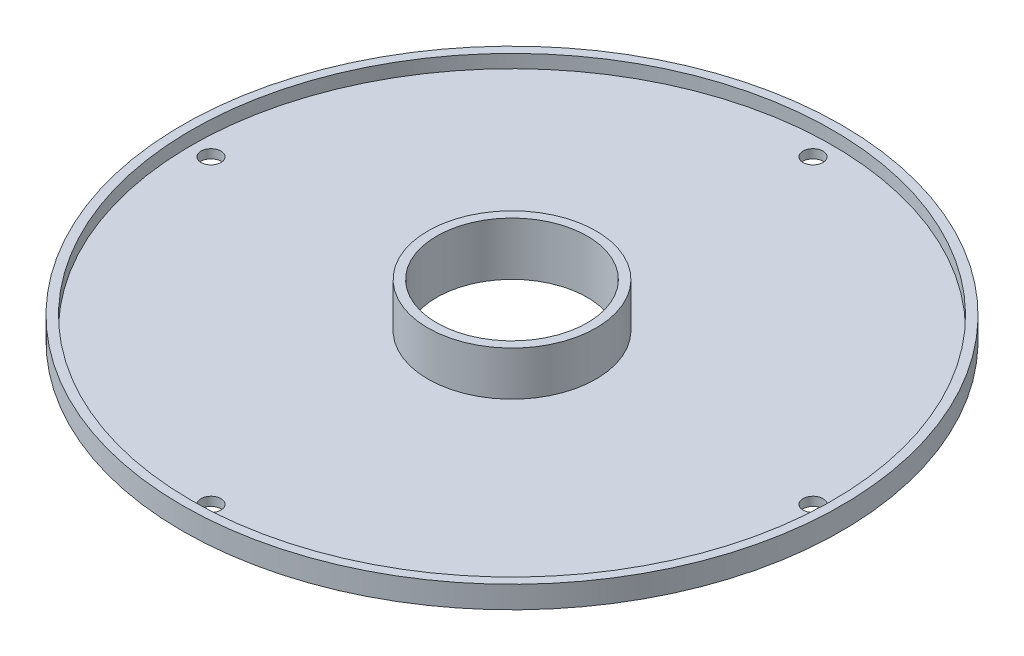
ISO-10303-21;
HEADER;
FILE_DESCRIPTION(('STEP AP214'),'2;1');
FILE_NAME('part.step','',(''),(''),'','','');
FILE_SCHEMA(('AUTOMOTIVE_DESIGN { 1 0 10303 214 1 1 1 1 }'));
ENDSEC;
DATA;
#1=APPLICATION_CONTEXT('core data for automotive mechanical design processes');
#2=APPLICATION_PROTOCOL_DEFINITION('international standard','automotive_design',2000,#1);
#3=PRODUCT_CONTEXT('',#1,'mechanical');
#4=PRODUCT('Part','Part','',(#3));
#5=PRODUCT_RELATED_PRODUCT_CATEGORY('part','',(#4));
#6=PRODUCT_DEFINITION_FORMATION('','',#4);
#7=PRODUCT_DEFINITION_CONTEXT('part definition',#1,'design');
#8=PRODUCT_DEFINITION('design','',#6,#7);
#9=PRODUCT_DEFINITION_SHAPE('','',#8);
#10=(LENGTH_UNIT() NAMED_UNIT(*) SI_UNIT(.MILLI.,.METRE.));
#11=(NAMED_UNIT(*) PLANE_ANGLE_UNIT() SI_UNIT($,.RADIAN.));
#12=(NAMED_UNIT(*) SI_UNIT($,.STERADIAN.) SOLID_ANGLE_UNIT());
#13=UNCERTAINTY_MEASURE_WITH_UNIT(LENGTH_MEASURE(1.E-05),#10,'distance_accuracy_value','');
#14=(GEOMETRIC_REPRESENTATION_CONTEXT(3) GLOBAL_UNCERTAINTY_ASSIGNED_CONTEXT((#13)) GLOBAL_UNIT_ASSIGNED_CONTEXT((#10,
#11,#12)) REPRESENTATION_CONTEXT('',''));
#15=CARTESIAN_POINT('',(0.,0.,0.));
#16=DIRECTION('',(0.,0.,1.));
#17=DIRECTION('',(1.,0.,0.));
#18=AXIS2_PLACEMENT_3D('',#15,#16,#17);
#19=CARTESIAN_POINT('',(0.,2.,0.));
#20=DIRECTION('',(0.,1.,0.));
#21=DIRECTION('',(0.,0.,1.));
#22=AXIS2_PLACEMENT_3D('',#19,#20,#21);
#23=PLANE('',#22);
#24=CARTESIAN_POINT('',(0.,2.,0.));
#25=DIRECTION('',(0.,1.,0.));
#26=DIRECTION('',(0.,0.,1.));
#27=AXIS2_PLACEMENT_3D('',#24,#25,#26);
#28=CIRCLE('',#27,19.);
#29=CARTESIAN_POINT('',(0.,2.,19.));
#30=VERTEX_POINT('',#29);
#31=EDGE_CURVE('E75',#30,#30,#28,.T.);
#32=ORIENTED_EDGE('',*,*,#31,.F.);
#33=EDGE_LOOP('',(#32));
#34=FACE_BOUND('',#33,.T.);
#35=CARTESIAN_POINT('',(-68.,2.,-4.74841462082666E-13));
#36=DIRECTION('',(0.,1.,0.));
#37=DIRECTION('',(0.,0.,1.));
#38=AXIS2_PLACEMENT_3D('',#35,#36,#37);
#39=CIRCLE('',#38,2.24999999999999);
#40=CARTESIAN_POINT('',(-68.,2.,2.24999999999952));
#41=VERTEX_POINT('',#40);
#42=EDGE_CURVE('E60',#41,#41,#39,.T.);
#43=ORIENTED_EDGE('',*,*,#42,.F.);
#44=EDGE_LOOP('',(#43));
#45=FACE_BOUND('',#44,.T.);
#46=CARTESIAN_POINT('',(68.,2.,0.));
#47=DIRECTION('',(0.,1.,0.));
#48=DIRECTION('',(0.,0.,1.));
#49=AXIS2_PLACEMENT_3D('',#46,#47,#48);
#50=CIRCLE('',#49,2.25);
#51=CARTESIAN_POINT('',(68.,2.,2.25));
#52=VERTEX_POINT('',#51);
#53=EDGE_CURVE('E44',#52,#52,#50,.T.);
#54=ORIENTED_EDGE('',*,*,#53,.F.);
#55=EDGE_LOOP('',(#54));
#56=FACE_BOUND('',#55,.T.);
#57=CARTESIAN_POINT('',(-2.37420731041333E-13,2.,68.));
#58=DIRECTION('',(0.,1.,0.));
#59=DIRECTION('',(0.,0.,1.));
#60=AXIS2_PLACEMENT_3D('',#57,#58,#59);
#61=CIRCLE('',#60,2.24999999999999);
#62=CARTESIAN_POINT('',(-2.37420731041333E-13,2.,70.25));
#63=VERTEX_POINT('',#62);
#64=EDGE_CURVE('E56',#63,#63,#61,.T.);
#65=ORIENTED_EDGE('',*,*,#64,.F.);
#66=EDGE_LOOP('',(#65));
#67=FACE_BOUND('',#66,.T.);
#68=CARTESIAN_POINT('',(7.12262193123999E-13,2.,-68.));
#69=DIRECTION('',(0.,1.,0.));
#70=DIRECTION('',(0.,0.,1.));
#71=AXIS2_PLACEMENT_3D('',#68,#69,#70);
#72=CIRCLE('',#71,2.24999999999999);
#73=CARTESIAN_POINT('',(7.12262193123999E-13,2.,-65.75));
#74=VERTEX_POINT('',#73);
#75=EDGE_CURVE('E66',#74,#74,#72,.T.);
#76=ORIENTED_EDGE('',*,*,#75,.F.);
#77=EDGE_LOOP('',(#76));
#78=FACE_BOUND('',#77,.T.);
#79=CARTESIAN_POINT('',(0.,2.,0.));
#80=DIRECTION('',(0.,1.,0.));
#81=DIRECTION('',(0.,0.,1.));
#82=AXIS2_PLACEMENT_3D('',#79,#80,#81);
#83=CIRCLE('',#82,72.45);
#84=CARTESIAN_POINT('',(0.,2.,72.45));
#85=VERTEX_POINT('',#84);
#86=EDGE_CURVE('E10',#85,#85,#83,.F.);
#87=ORIENTED_EDGE('',*,*,#86,.F.);
#88=EDGE_LOOP('',(#87));
#89=FACE_BOUND('',#88,.T.);
#90=ADVANCED_FACE('F33',(#34,#45,#56,#67,#78,#89),#23,.T.);
#91=CARTESIAN_POINT('',(0.,0.,0.));
#92=DIRECTION('',(0.,1.,0.));
#93=DIRECTION('',(0.,0.,1.));
#94=AXIS2_PLACEMENT_3D('',#91,#92,#93);
#95=PLANE('',#94);
#96=CARTESIAN_POINT('',(0.,0.,0.));
#97=DIRECTION('',(0.,1.,0.));
#98=DIRECTION('',(0.,0.,1.));
#99=AXIS2_PLACEMENT_3D('',#96,#97,#98);
#100=CIRCLE('',#99,74.45);
#101=CARTESIAN_POINT('',(0.,0.,74.45));
#102=VERTEX_POINT('',#101);
#103=EDGE_CURVE('E40',#102,#102,#100,.T.);
#104=ORIENTED_EDGE('',*,*,#103,.F.);
#105=EDGE_LOOP('',(#104));
#106=FACE_BOUND('',#105,.T.);
#107=CARTESIAN_POINT('',(68.,0.,0.));
#108=DIRECTION('',(0.,1.,0.));
#109=DIRECTION('',(0.,0.,1.));
#110=AXIS2_PLACEMENT_3D('',#107,#108,#109);
#111=CIRCLE('',#110,2.25);
#112=CARTESIAN_POINT('',(68.,0.,2.25));
#113=VERTEX_POINT('',#112);
#114=EDGE_CURVE('E48',#113,#113,#111,.T.);
#115=ORIENTED_EDGE('',*,*,#114,.T.);
#116=EDGE_LOOP('',(#115));
#117=FACE_BOUND('',#116,.T.);
#118=CARTESIAN_POINT('',(0.,0.,0.));
#119=DIRECTION('',(0.,1.,0.));
#120=DIRECTION('',(0.,0.,1.));
#121=AXIS2_PLACEMENT_3D('',#118,#119,#120);
#122=CIRCLE('',#121,17.);
#123=CARTESIAN_POINT('',(0.,0.,17.));
#124=VERTEX_POINT('',#123);
#125=EDGE_CURVE('E52',#124,#124,#122,.T.);
#126=ORIENTED_EDGE('',*,*,#125,.T.);
#127=EDGE_LOOP('',(#126));
#128=FACE_BOUND('',#127,.T.);
#129=CARTESIAN_POINT('',(-2.37420731041333E-13,0.,68.));
#130=DIRECTION('',(0.,1.,0.));
#131=DIRECTION('',(0.,0.,1.));
#132=AXIS2_PLACEMENT_3D('',#129,#130,#131);
#133=CIRCLE('',#132,2.24999999999999);
#134=CARTESIAN_POINT('',(-2.37420731041333E-13,0.,70.25));
#135=VERTEX_POINT('',#134);
#136=EDGE_CURVE('E57',#135,#135,#133,.T.);
#137=ORIENTED_EDGE('',*,*,#136,.T.);
#138=EDGE_LOOP('',(#137));
#139=FACE_BOUND('',#138,.T.);
#140=CARTESIAN_POINT('',(-68.,0.,-4.74841462082666E-13));
#141=DIRECTION('',(0.,1.,0.));
#142=DIRECTION('',(0.,0.,1.));
#143=AXIS2_PLACEMENT_3D('',#140,#141,#142);
#144=CIRCLE('',#143,2.24999999999999);
#145=CARTESIAN_POINT('',(-68.,0.,2.24999999999952));
#146=VERTEX_POINT('',#145);
#147=EDGE_CURVE('E63',#146,#146,#144,.T.);
#148=ORIENTED_EDGE('',*,*,#147,.T.);
#149=EDGE_LOOP('',(#148));
#150=FACE_BOUND('',#149,.T.);
#151=CARTESIAN_POINT('',(7.12262193123999E-13,0.,-68.));
#152=DIRECTION('',(0.,1.,0.));
#153=DIRECTION('',(0.,0.,1.));
#154=AXIS2_PLACEMENT_3D('',#151,#152,#153);
#155=CIRCLE('',#154,2.24999999999999);
#156=CARTESIAN_POINT('',(7.12262193123999E-13,0.,-65.75));
#157=VERTEX_POINT('',#156);
#158=EDGE_CURVE('E69',#157,#157,#155,.T.);
#159=ORIENTED_EDGE('',*,*,#158,.T.);
#160=EDGE_LOOP('',(#159));
#161=FACE_BOUND('',#160,.T.);
#162=ADVANCED_FACE('F107',(#106,#117,#128,#139,#150,#161),#95,.F.);
#163=CARTESIAN_POINT('',(0.,2.,0.));
#164=DIRECTION('',(0.,-1.,0.));
#165=DIRECTION('',(0.,0.,-1.));
#166=AXIS2_PLACEMENT_3D('',#163,#164,#165);
#167=CYLINDRICAL_SURFACE('',#166,74.45);
#168=ORIENTED_EDGE('',*,*,#103,.T.);
#169=EDGE_LOOP('',(#168));
#170=FACE_BOUND('',#169,.T.);
#171=CARTESIAN_POINT('',(0.,5.,0.));
#172=DIRECTION('',(0.,1.,0.));
#173=DIRECTION('',(0.,0.,1.));
#174=AXIS2_PLACEMENT_3D('',#171,#172,#173);
#175=CIRCLE('',#174,74.45);
#176=CARTESIAN_POINT('',(0.,5.,74.45));
#177=VERTEX_POINT('',#176);
#178=EDGE_CURVE('E83',#177,#177,#175,.T.);
#179=ORIENTED_EDGE('',*,*,#178,.F.);
#180=EDGE_LOOP('',(#179));
#181=FACE_BOUND('',#180,.T.);
#182=ADVANCED_FACE('F35',(#170,#181),#167,.T.);
#183=CARTESIAN_POINT('',(68.,2.,0.));
#184=DIRECTION('',(0.,-1.,0.));
#185=DIRECTION('',(0.,0.,-1.));
#186=AXIS2_PLACEMENT_3D('',#183,#184,#185);
#187=CYLINDRICAL_SURFACE('',#186,2.25);
#188=ORIENTED_EDGE('',*,*,#53,.T.);
#189=EDGE_LOOP('',(#188));
#190=FACE_BOUND('',#189,.T.);
#191=ORIENTED_EDGE('',*,*,#114,.F.);
#192=EDGE_LOOP('',(#191));
#193=FACE_BOUND('',#192,.T.);
#194=ADVANCED_FACE('F117',(#190,#193),#187,.F.);
#195=CARTESIAN_POINT('',(0.,2.,0.));
#196=DIRECTION('',(0.,-1.,0.));
#197=DIRECTION('',(0.,0.,-1.));
#198=AXIS2_PLACEMENT_3D('',#195,#196,#197);
#199=CYLINDRICAL_SURFACE('',#198,17.);
#200=ORIENTED_EDGE('',*,*,#125,.F.);
#201=EDGE_LOOP('',(#200));
#202=FACE_BOUND('',#201,.T.);
#203=CARTESIAN_POINT('',(0.,12.,0.));
#204=DIRECTION('',(0.,1.,0.));
#205=DIRECTION('',(0.,0.,1.));
#206=AXIS2_PLACEMENT_3D('',#203,#204,#205);
#207=CIRCLE('',#206,17.);
#208=CARTESIAN_POINT('',(0.,12.,17.));
#209=VERTEX_POINT('',#208);
#210=EDGE_CURVE('E78',#209,#209,#207,.T.);
#211=ORIENTED_EDGE('',*,*,#210,.T.);
#212=EDGE_LOOP('',(#211));
#213=FACE_BOUND('',#212,.T.);
#214=ADVANCED_FACE('F120',(#202,#213),#199,.F.);
#215=CARTESIAN_POINT('',(-2.37420731041333E-13,2.,68.));
#216=DIRECTION('',(0.,-1.,0.));
#217=DIRECTION('',(0.,0.,-1.));
#218=AXIS2_PLACEMENT_3D('',#215,#216,#217);
#219=CYLINDRICAL_SURFACE('',#218,2.24999999999999);
#220=ORIENTED_EDGE('',*,*,#64,.T.);
#221=EDGE_LOOP('',(#220));
#222=FACE_BOUND('',#221,.T.);
#223=ORIENTED_EDGE('',*,*,#136,.F.);
#224=EDGE_LOOP('',(#223));
#225=FACE_BOUND('',#224,.T.);
#226=ADVANCED_FACE('F124',(#222,#225),#219,.F.);
#227=CARTESIAN_POINT('',(-68.,2.,-4.74841462082666E-13));
#228=DIRECTION('',(0.,-1.,0.));
#229=DIRECTION('',(0.,0.,-1.));
#230=AXIS2_PLACEMENT_3D('',#227,#228,#229);
#231=CYLINDRICAL_SURFACE('',#230,2.24999999999999);
#232=ORIENTED_EDGE('',*,*,#42,.T.);
#233=EDGE_LOOP('',(#232));
#234=FACE_BOUND('',#233,.T.);
#235=ORIENTED_EDGE('',*,*,#147,.F.);
#236=EDGE_LOOP('',(#235));
#237=FACE_BOUND('',#236,.T.);
#238=ADVANCED_FACE('F128',(#234,#237),#231,.F.);
#239=CARTESIAN_POINT('',(7.12262193123999E-13,2.,-68.));
#240=DIRECTION('',(0.,-1.,0.));
#241=DIRECTION('',(0.,0.,-1.));
#242=AXIS2_PLACEMENT_3D('',#239,#240,#241);
#243=CYLINDRICAL_SURFACE('',#242,2.24999999999999);
#244=ORIENTED_EDGE('',*,*,#75,.T.);
#245=EDGE_LOOP('',(#244));
#246=FACE_BOUND('',#245,.T.);
#247=ORIENTED_EDGE('',*,*,#158,.F.);
#248=EDGE_LOOP('',(#247));
#249=FACE_BOUND('',#248,.T.);
#250=ADVANCED_FACE('F132',(#246,#249),#243,.F.);
#251=CARTESIAN_POINT('',(0.,12.,0.));
#252=DIRECTION('',(0.,1.,0.));
#253=DIRECTION('',(0.,0.,1.));
#254=AXIS2_PLACEMENT_3D('',#251,#252,#253);
#255=PLANE('',#254);
#256=CARTESIAN_POINT('',(0.,12.,0.));
#257=DIRECTION('',(0.,1.,0.));
#258=DIRECTION('',(0.,0.,1.));
#259=AXIS2_PLACEMENT_3D('',#256,#257,#258);
#260=CIRCLE('',#259,19.);
#261=CARTESIAN_POINT('',(0.,12.,19.));
#262=VERTEX_POINT('',#261);
#263=EDGE_CURVE('E72',#262,#262,#260,.T.);
#264=ORIENTED_EDGE('',*,*,#263,.T.);
#265=EDGE_LOOP('',(#264));
#266=FACE_BOUND('',#265,.T.);
#267=ORIENTED_EDGE('',*,*,#210,.F.);
#268=EDGE_LOOP('',(#267));
#269=FACE_BOUND('',#268,.T.);
#270=ADVANCED_FACE('F102',(#266,#269),#255,.T.);
#271=CARTESIAN_POINT('',(0.,12.,0.));
#272=DIRECTION('',(0.,-1.,0.));
#273=DIRECTION('',(0.,0.,-1.));
#274=AXIS2_PLACEMENT_3D('',#271,#272,#273);
#275=CYLINDRICAL_SURFACE('',#274,19.);
#276=ORIENTED_EDGE('',*,*,#263,.F.);
#277=EDGE_LOOP('',(#276));
#278=FACE_BOUND('',#277,.T.);
#279=ORIENTED_EDGE('',*,*,#31,.T.);
#280=EDGE_LOOP('',(#279));
#281=FACE_BOUND('',#280,.T.);
#282=ADVANCED_FACE('F94',(#278,#281),#275,.T.);
#283=CARTESIAN_POINT('',(0.,5.,0.));
#284=DIRECTION('',(0.,1.,0.));
#285=DIRECTION('',(0.,0.,1.));
#286=AXIS2_PLACEMENT_3D('',#283,#284,#285);
#287=PLANE('',#286);
#288=ORIENTED_EDGE('',*,*,#178,.T.);
#289=EDGE_LOOP('',(#288));
#290=FACE_BOUND('',#289,.T.);
#291=CARTESIAN_POINT('',(0.,5.,0.));
#292=DIRECTION('',(0.,1.,0.));
#293=DIRECTION('',(0.,0.,1.));
#294=AXIS2_PLACEMENT_3D('',#291,#292,#293);
#295=CIRCLE('',#294,72.45);
#296=CARTESIAN_POINT('',(0.,5.,72.45));
#297=VERTEX_POINT('',#296);
#298=EDGE_CURVE('E86',#297,#297,#295,.T.);
#299=ORIENTED_EDGE('',*,*,#298,.F.);
#300=EDGE_LOOP('',(#299));
#301=FACE_BOUND('',#300,.T.);
#302=ADVANCED_FACE('F92',(#290,#301),#287,.T.);
#303=CARTESIAN_POINT('',(0.,5.,0.));
#304=DIRECTION('',(0.,-1.,0.));
#305=DIRECTION('',(0.,0.,-1.));
#306=AXIS2_PLACEMENT_3D('',#303,#304,#305);
#307=CYLINDRICAL_SURFACE('',#306,72.45);
#308=ORIENTED_EDGE('',*,*,#298,.T.);
#309=EDGE_LOOP('',(#308));
#310=FACE_BOUND('',#309,.T.);
#311=ORIENTED_EDGE('',*,*,#86,.T.);
#312=EDGE_LOOP('',(#311));
#313=FACE_BOUND('',#312,.T.);
#314=ADVANCED_FACE('F90',(#310,#313),#307,.F.);
#315=CLOSED_SHELL('',(#90,#162,#182,#194,#214,#226,#238,#250,#270,#282,#302,#314));
#316=MANIFOLD_SOLID_BREP('B2',#315);
#317=ADVANCED_BREP_SHAPE_REPRESENTATION('',(#18,#316),#14);
#318=SHAPE_DEFINITION_REPRESENTATION(#9,#317);
ENDSEC;
END-ISO-10303-21;
